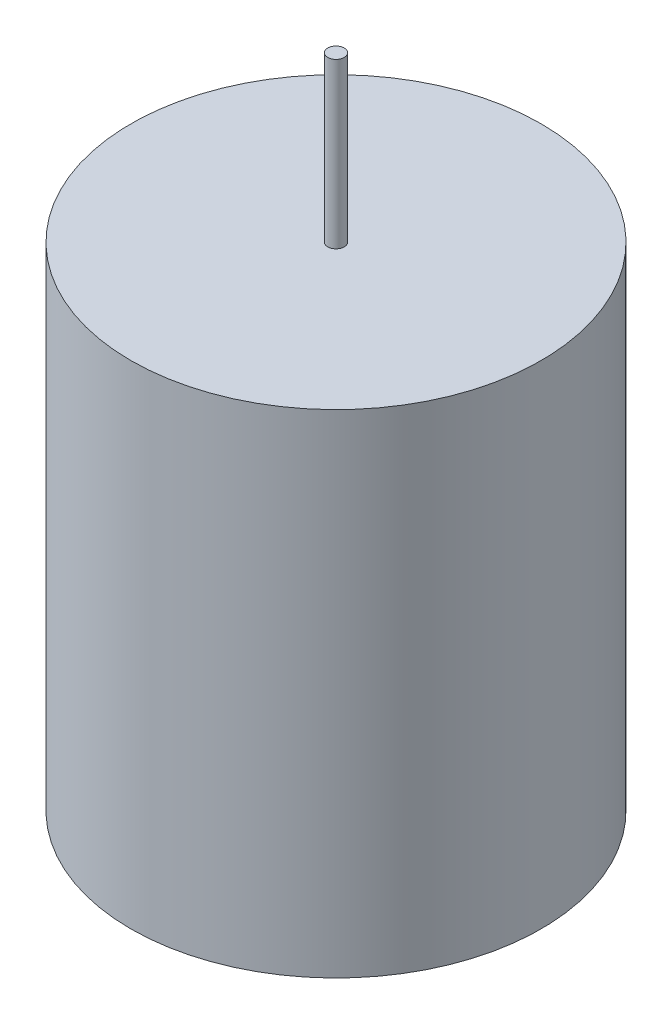
ISO-10303-21;
HEADER;
FILE_DESCRIPTION(('STEP AP214'),'2;1');
FILE_NAME('part.step','',(''),(''),'','','');
FILE_SCHEMA(('AUTOMOTIVE_DESIGN { 1 0 10303 214 1 1 1 1 }'));
ENDSEC;
DATA;
#1=APPLICATION_CONTEXT('core data for automotive mechanical design processes');
#2=APPLICATION_PROTOCOL_DEFINITION('international standard','automotive_design',2000,#1);
#3=PRODUCT_CONTEXT('',#1,'mechanical');
#4=PRODUCT('Part','Part','',(#3));
#5=PRODUCT_RELATED_PRODUCT_CATEGORY('part','',(#4));
#6=PRODUCT_DEFINITION_FORMATION('','',#4);
#7=PRODUCT_DEFINITION_CONTEXT('part definition',#1,'design');
#8=PRODUCT_DEFINITION('design','',#6,#7);
#9=PRODUCT_DEFINITION_SHAPE('','',#8);
#10=(LENGTH_UNIT() NAMED_UNIT(*) SI_UNIT(.MILLI.,.METRE.));
#11=(NAMED_UNIT(*) PLANE_ANGLE_UNIT() SI_UNIT($,.RADIAN.));
#12=(NAMED_UNIT(*) SI_UNIT($,.STERADIAN.) SOLID_ANGLE_UNIT());
#13=UNCERTAINTY_MEASURE_WITH_UNIT(LENGTH_MEASURE(1.E-05),#10,'distance_accuracy_value','');
#14=(GEOMETRIC_REPRESENTATION_CONTEXT(3) GLOBAL_UNCERTAINTY_ASSIGNED_CONTEXT((#13)) GLOBAL_UNIT_ASSIGNED_CONTEXT((#10,
#11,#12)) REPRESENTATION_CONTEXT('',''));
#15=CARTESIAN_POINT('',(0.,0.,0.));
#16=DIRECTION('',(0.,0.,1.));
#17=DIRECTION('',(1.,0.,0.));
#18=AXIS2_PLACEMENT_3D('',#15,#16,#17);
#19=CARTESIAN_POINT('',(0.,30.,0.));
#20=DIRECTION('',(0.,-1.,0.));
#21=DIRECTION('',(0.,0.,-1.));
#22=AXIS2_PLACEMENT_3D('',#19,#20,#21);
#23=CYLINDRICAL_SURFACE('',#22,12.5);
#24=CARTESIAN_POINT('',(0.,30.,0.));
#25=DIRECTION('',(0.,1.,0.));
#26=DIRECTION('',(0.,0.,1.));
#27=AXIS2_PLACEMENT_3D('',#24,#25,#26);
#28=CIRCLE('',#27,12.5);
#29=CARTESIAN_POINT('',(0.,30.,12.5));
#30=VERTEX_POINT('',#29);
#31=EDGE_CURVE('E45',#30,#30,#28,.T.);
#32=ORIENTED_EDGE('',*,*,#31,.F.);
#33=EDGE_LOOP('',(#32));
#34=FACE_BOUND('',#33,.T.);
#35=CARTESIAN_POINT('',(0.,0.,0.));
#36=DIRECTION('',(0.,1.,0.));
#37=DIRECTION('',(0.,0.,1.));
#38=AXIS2_PLACEMENT_3D('',#35,#36,#37);
#39=CIRCLE('',#38,12.5);
#40=CARTESIAN_POINT('',(0.,0.,12.5));
#41=VERTEX_POINT('',#40);
#42=EDGE_CURVE('E50',#41,#41,#39,.T.);
#43=ORIENTED_EDGE('',*,*,#42,.T.);
#44=EDGE_LOOP('',(#43));
#45=FACE_BOUND('',#44,.T.);
#46=ADVANCED_FACE('F38',(#34,#45),#23,.T.);
#47=CARTESIAN_POINT('',(0.,30.,0.));
#48=DIRECTION('',(0.,1.,0.));
#49=DIRECTION('',(0.,0.,1.));
#50=AXIS2_PLACEMENT_3D('',#47,#48,#49);
#51=PLANE('',#50);
#52=CARTESIAN_POINT('',(0.,30.,0.));
#53=DIRECTION('',(0.,1.,0.));
#54=DIRECTION('',(0.,0.,1.));
#55=AXIS2_PLACEMENT_3D('',#52,#53,#54);
#56=CIRCLE('',#55,0.5);
#57=CARTESIAN_POINT('',(0.,30.,0.5));
#58=VERTEX_POINT('',#57);
#59=EDGE_CURVE('E10',#58,#58,#56,.T.);
#60=ORIENTED_EDGE('',*,*,#59,.F.);
#61=EDGE_LOOP('',(#60));
#62=FACE_BOUND('',#61,.T.);
#63=ORIENTED_EDGE('',*,*,#31,.T.);
#64=EDGE_LOOP('',(#63));
#65=FACE_BOUND('',#64,.T.);
#66=ADVANCED_FACE('F83',(#62,#65),#51,.T.);
#67=CARTESIAN_POINT('',(0.,0.,0.));
#68=DIRECTION('',(0.,1.,0.));
#69=DIRECTION('',(0.,0.,1.));
#70=AXIS2_PLACEMENT_3D('',#67,#68,#69);
#71=PLANE('',#70);
#72=CARTESIAN_POINT('',(0.,0.,0.));
#73=DIRECTION('',(0.,1.,0.));
#74=DIRECTION('',(0.,0.,1.));
#75=AXIS2_PLACEMENT_3D('',#72,#73,#74);
#76=CIRCLE('',#75,0.5);
#77=CARTESIAN_POINT('',(0.,0.,0.5));
#78=VERTEX_POINT('',#77);
#79=EDGE_CURVE('E41',#78,#78,#76,.T.);
#80=ORIENTED_EDGE('',*,*,#79,.T.);
#81=EDGE_LOOP('',(#80));
#82=FACE_BOUND('',#81,.T.);
#83=ORIENTED_EDGE('',*,*,#42,.F.);
#84=EDGE_LOOP('',(#83));
#85=FACE_BOUND('',#84,.T.);
#86=ADVANCED_FACE('F88',(#82,#85),#71,.F.);
#87=CARTESIAN_POINT('',(0.,-5.,0.));
#88=DIRECTION('',(0.,1.,0.));
#89=DIRECTION('',(0.,0.,1.));
#90=AXIS2_PLACEMENT_3D('',#87,#88,#89);
#91=PLANE('',#90);
#92=CARTESIAN_POINT('',(0.,-5.,0.));
#93=DIRECTION('',(0.,1.,0.));
#94=DIRECTION('',(0.,0.,1.));
#95=AXIS2_PLACEMENT_3D('',#92,#93,#94);
#96=CIRCLE('',#95,0.5);
#97=CARTESIAN_POINT('',(0.,-5.,0.5));
#98=VERTEX_POINT('',#97);
#99=EDGE_CURVE('E53',#98,#98,#96,.T.);
#100=ORIENTED_EDGE('',*,*,#99,.F.);
#101=EDGE_LOOP('',(#100));
#102=FACE_BOUND('',#101,.T.);
#103=ADVANCED_FACE('F79',(#102),#91,.F.);
#104=CARTESIAN_POINT('',(0.,-5.,0.));
#105=DIRECTION('',(0.,1.,0.));
#106=DIRECTION('',(0.,0.,1.));
#107=AXIS2_PLACEMENT_3D('',#104,#105,#106);
#108=CYLINDRICAL_SURFACE('',#107,0.5);
#109=ORIENTED_EDGE('',*,*,#99,.T.);
#110=EDGE_LOOP('',(#109));
#111=FACE_BOUND('',#110,.T.);
#112=ORIENTED_EDGE('',*,*,#79,.F.);
#113=EDGE_LOOP('',(#112));
#114=FACE_BOUND('',#113,.T.);
#115=ADVANCED_FACE('F72',(#111,#114),#108,.T.);
#116=ORIENTED_EDGE('',*,*,#59,.T.);
#117=EDGE_LOOP('',(#116));
#118=FACE_BOUND('',#117,.T.);
#119=CARTESIAN_POINT('',(0.,40.,0.));
#120=DIRECTION('',(0.,1.,0.));
#121=DIRECTION('',(0.,0.,1.));
#122=AXIS2_PLACEMENT_3D('',#119,#120,#121);
#123=CIRCLE('',#122,0.5);
#124=CARTESIAN_POINT('',(0.,40.,0.5));
#125=VERTEX_POINT('',#124);
#126=EDGE_CURVE('E62',#125,#125,#123,.T.);
#127=ORIENTED_EDGE('',*,*,#126,.F.);
#128=EDGE_LOOP('',(#127));
#129=FACE_BOUND('',#128,.T.);
#130=ADVANCED_FACE('F70',(#118,#129),#108,.T.);
#131=CARTESIAN_POINT('',(0.,40.,0.));
#132=DIRECTION('',(0.,1.,0.));
#133=DIRECTION('',(0.,0.,1.));
#134=AXIS2_PLACEMENT_3D('',#131,#132,#133);
#135=PLANE('',#134);
#136=ORIENTED_EDGE('',*,*,#126,.T.);
#137=EDGE_LOOP('',(#136));
#138=FACE_BOUND('',#137,.T.);
#139=ADVANCED_FACE('F68',(#138),#135,.T.);
#140=CLOSED_SHELL('',(#46,#66,#86,#103,#115,#130,#139));
#141=MANIFOLD_SOLID_BREP('B2',#140);
#142=ADVANCED_BREP_SHAPE_REPRESENTATION('',(#18,#141),#14);
#143=SHAPE_DEFINITION_REPRESENTATION(#9,#142);
ENDSEC;
END-ISO-10303-21;
